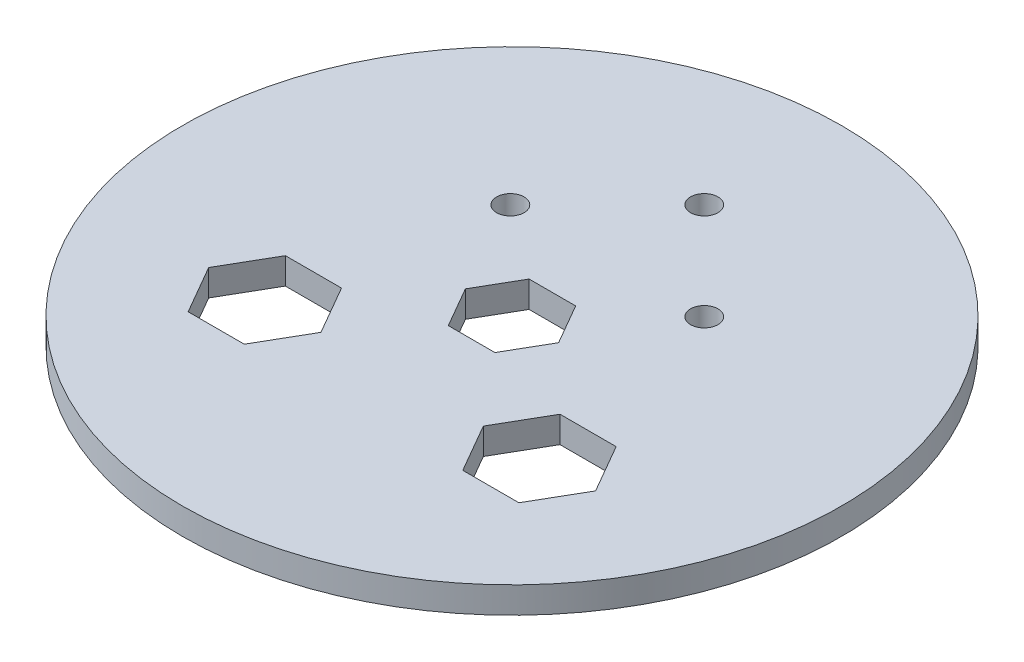
ISO-10303-21;
HEADER;
FILE_DESCRIPTION(('STEP AP214'),'2;1');
FILE_NAME('part.step','',(''),(''),'','','');
FILE_SCHEMA(('AUTOMOTIVE_DESIGN { 1 0 10303 214 1 1 1 1 }'));
ENDSEC;
DATA;
#1=APPLICATION_CONTEXT('core data for automotive mechanical design processes');
#2=APPLICATION_PROTOCOL_DEFINITION('international standard','automotive_design',2000,#1);
#3=PRODUCT_CONTEXT('',#1,'mechanical');
#4=PRODUCT('Part','Part','',(#3));
#5=PRODUCT_RELATED_PRODUCT_CATEGORY('part','',(#4));
#6=PRODUCT_DEFINITION_FORMATION('','',#4);
#7=PRODUCT_DEFINITION_CONTEXT('part definition',#1,'design');
#8=PRODUCT_DEFINITION('design','',#6,#7);
#9=PRODUCT_DEFINITION_SHAPE('','',#8);
#10=(LENGTH_UNIT() NAMED_UNIT(*) SI_UNIT(.MILLI.,.METRE.));
#11=(NAMED_UNIT(*) PLANE_ANGLE_UNIT() SI_UNIT($,.RADIAN.));
#12=(NAMED_UNIT(*) SI_UNIT($,.STERADIAN.) SOLID_ANGLE_UNIT());
#13=UNCERTAINTY_MEASURE_WITH_UNIT(LENGTH_MEASURE(1.E-05),#10,'distance_accuracy_value','');
#14=(GEOMETRIC_REPRESENTATION_CONTEXT(3) GLOBAL_UNCERTAINTY_ASSIGNED_CONTEXT((#13)) GLOBAL_UNIT_ASSIGNED_CONTEXT((#10,
#11,#12)) REPRESENTATION_CONTEXT('',''));
#15=CARTESIAN_POINT('',(0.,0.,0.));
#16=DIRECTION('',(0.,0.,1.));
#17=DIRECTION('',(1.,0.,0.));
#18=AXIS2_PLACEMENT_3D('',#15,#16,#17);
#19=CARTESIAN_POINT('',(0.,2.4,0.));
#20=DIRECTION('',(0.,1.,0.));
#21=DIRECTION('',(0.,0.,1.));
#22=AXIS2_PLACEMENT_3D('',#19,#20,#21);
#23=PLANE('',#22);
#24=CARTESIAN_POINT('',(-1.57534575662144E-13,2.4,-35.0000000000001));
#25=DIRECTION('',(0.,1.,0.));
#26=DIRECTION('',(0.,0.,1.));
#27=AXIS2_PLACEMENT_3D('',#24,#25,#26);
#28=CIRCLE('',#27,2.5);
#29=CARTESIAN_POINT('',(-1.57534575662144E-13,2.4,-32.5000000000001));
#30=VERTEX_POINT('',#29);
#31=EDGE_CURVE('E459',#30,#30,#28,.T.);
#32=ORIENTED_EDGE('',*,*,#31,.F.);
#33=EDGE_LOOP('',(#32));
#34=FACE_BOUND('',#33,.T.);
#35=CARTESIAN_POINT('',(17.6499999999998,2.4,-17.3500000000001));
#36=DIRECTION('',(0.,1.,0.));
#37=DIRECTION('',(0.,0.,1.));
#38=AXIS2_PLACEMENT_3D('',#35,#36,#37);
#39=CIRCLE('',#38,2.5);
#40=CARTESIAN_POINT('',(17.6499999999998,2.4,-14.8500000000001));
#41=VERTEX_POINT('',#40);
#42=EDGE_CURVE('E464',#41,#41,#39,.T.);
#43=ORIENTED_EDGE('',*,*,#42,.F.);
#44=EDGE_LOOP('',(#43));
#45=FACE_BOUND('',#44,.T.);
#46=CARTESIAN_POINT('',(-17.6500000000002,2.4,-17.3500000000001));
#47=DIRECTION('',(0.,1.,0.));
#48=DIRECTION('',(0.,0.,1.));
#49=AXIS2_PLACEMENT_3D('',#46,#47,#48);
#50=CIRCLE('',#49,2.5);
#51=CARTESIAN_POINT('',(-17.6500000000002,2.4,-14.8500000000001));
#52=VERTEX_POINT('',#51);
#53=EDGE_CURVE('E471',#52,#52,#50,.T.);
#54=ORIENTED_EDGE('',*,*,#53,.F.);
#55=EDGE_LOOP('',(#54));
#56=FACE_BOUND('',#55,.T.);
#57=CARTESIAN_POINT('',(0.,2.4,0.));
#58=DIRECTION('',(0.,1.,0.));
#59=DIRECTION('',(0.,0.,1.));
#60=AXIS2_PLACEMENT_3D('',#57,#58,#59);
#61=CIRCLE('',#60,60.);
#62=CARTESIAN_POINT('',(0.,2.4,60.));
#63=VERTEX_POINT('',#62);
#64=EDGE_CURVE('E11',#63,#63,#61,.T.);
#65=ORIENTED_EDGE('',*,*,#64,.T.);
#66=EDGE_LOOP('',(#65));
#67=FACE_BOUND('',#66,.T.);
#68=DIRECTION('',(-0.5,0.,-0.866025403784438));
#69=VECTOR('',#68,1.);
#70=CARTESIAN_POINT('',(8.4870489570875,2.4,0.));
#71=LINE('',#70,#69);
#72=CARTESIAN_POINT('',(8.4870489570875,2.4,0.));
#73=VERTEX_POINT('',#72);
#74=CARTESIAN_POINT('',(4.24352447854375,2.4,-7.35));
#75=VERTEX_POINT('',#74);
#76=EDGE_CURVE('E258',#73,#75,#71,.T.);
#77=ORIENTED_EDGE('',*,*,#76,.F.);
#78=DIRECTION('',(0.5,0.,-0.866025403784439));
#79=VECTOR('',#78,1.);
#80=CARTESIAN_POINT('',(4.24352447854375,2.4,7.35));
#81=LINE('',#80,#79);
#82=CARTESIAN_POINT('',(4.24352447854375,2.4,7.35));
#83=VERTEX_POINT('',#82);
#84=EDGE_CURVE('E256',#83,#73,#81,.T.);
#85=ORIENTED_EDGE('',*,*,#84,.F.);
#86=DIRECTION('',(1.,0.,0.));
#87=VECTOR('',#86,1.);
#88=CARTESIAN_POINT('',(-4.24352447854375,2.4,7.35));
#89=LINE('',#88,#87);
#90=CARTESIAN_POINT('',(-4.24352447854375,2.4,7.35));
#91=VERTEX_POINT('',#90);
#92=EDGE_CURVE('E268',#91,#83,#89,.T.);
#93=ORIENTED_EDGE('',*,*,#92,.F.);
#94=DIRECTION('',(0.5,0.,0.866025403784439));
#95=VECTOR('',#94,1.);
#96=CARTESIAN_POINT('',(-8.4870489570875,2.4,0.));
#97=LINE('',#96,#95);
#98=CARTESIAN_POINT('',(-8.4870489570875,2.4,0.));
#99=VERTEX_POINT('',#98);
#100=EDGE_CURVE('E265',#99,#91,#97,.T.);
#101=ORIENTED_EDGE('',*,*,#100,.F.);
#102=DIRECTION('',(-0.5,0.,0.866025403784439));
#103=VECTOR('',#102,1.);
#104=CARTESIAN_POINT('',(-4.24352447854375,2.4,-7.35));
#105=LINE('',#104,#103);
#106=CARTESIAN_POINT('',(-4.24352447854375,2.4,-7.35));
#107=VERTEX_POINT('',#106);
#108=EDGE_CURVE('E263',#107,#99,#105,.T.);
#109=ORIENTED_EDGE('',*,*,#108,.F.);
#110=DIRECTION('',(-1.,0.,0.));
#111=VECTOR('',#110,1.);
#112=CARTESIAN_POINT('',(4.24352447854375,2.4,-7.35));
#113=LINE('',#112,#111);
#114=EDGE_CURVE('E261',#75,#107,#113,.T.);
#115=ORIENTED_EDGE('',*,*,#114,.F.);
#116=EDGE_LOOP('',(#77,#85,#93,#101,#109,#115));
#117=FACE_BOUND('',#116,.T.);
#118=DIRECTION('',(-0.5,0.,-0.866025403784439));
#119=VECTOR('',#118,1.);
#120=CARTESIAN_POINT('',(-14.7809002353436,2.4,20.));
#121=LINE('',#120,#119);
#122=CARTESIAN_POINT('',(-14.7809002353436,2.4,20.));
#123=VERTEX_POINT('',#122);
#124=CARTESIAN_POINT('',(-19.8904501176718,2.4,11.15));
#125=VERTEX_POINT('',#124);
#126=EDGE_CURVE('E213',#123,#125,#121,.T.);
#127=ORIENTED_EDGE('',*,*,#126,.F.);
#128=DIRECTION('',(0.5,0.,-0.866025403784439));
#129=VECTOR('',#128,1.);
#130=CARTESIAN_POINT('',(-19.8904501176718,2.4,28.85));
#131=LINE('',#130,#129);
#132=CARTESIAN_POINT('',(-19.8904501176718,2.4,28.85));
#133=VERTEX_POINT('',#132);
#134=EDGE_CURVE('E211',#133,#123,#131,.T.);
#135=ORIENTED_EDGE('',*,*,#134,.F.);
#136=DIRECTION('',(1.,0.,0.));
#137=VECTOR('',#136,1.);
#138=CARTESIAN_POINT('',(-30.1095498823282,2.4,28.85));
#139=LINE('',#138,#137);
#140=CARTESIAN_POINT('',(-30.1095498823282,2.4,28.85));
#141=VERTEX_POINT('',#140);
#142=EDGE_CURVE('E223',#141,#133,#139,.T.);
#143=ORIENTED_EDGE('',*,*,#142,.F.);
#144=DIRECTION('',(0.5,0.,0.866025403784439));
#145=VECTOR('',#144,1.);
#146=CARTESIAN_POINT('',(-35.2190997646564,2.4,20.));
#147=LINE('',#146,#145);
#148=CARTESIAN_POINT('',(-35.2190997646564,2.4,20.));
#149=VERTEX_POINT('',#148);
#150=EDGE_CURVE('E220',#149,#141,#147,.T.);
#151=ORIENTED_EDGE('',*,*,#150,.F.);
#152=DIRECTION('',(-0.5,0.,0.866025403784439));
#153=VECTOR('',#152,1.);
#154=CARTESIAN_POINT('',(-30.1095498823282,2.4,11.15));
#155=LINE('',#154,#153);
#156=CARTESIAN_POINT('',(-30.1095498823282,2.4,11.15));
#157=VERTEX_POINT('',#156);
#158=EDGE_CURVE('E218',#157,#149,#155,.T.);
#159=ORIENTED_EDGE('',*,*,#158,.F.);
#160=DIRECTION('',(-1.,0.,0.));
#161=VECTOR('',#160,1.);
#162=CARTESIAN_POINT('',(-19.8904501176718,2.4,11.15));
#163=LINE('',#162,#161);
#164=EDGE_CURVE('E216',#125,#157,#163,.T.);
#165=ORIENTED_EDGE('',*,*,#164,.F.);
#166=EDGE_LOOP('',(#127,#135,#143,#151,#159,#165));
#167=FACE_BOUND('',#166,.T.);
#168=DIRECTION('',(-0.5,0.,-0.866025403784439));
#169=VECTOR('',#168,1.);
#170=CARTESIAN_POINT('',(35.2190997646564,2.4,20.));
#171=LINE('',#170,#169);
#172=CARTESIAN_POINT('',(35.2190997646564,2.4,20.));
#173=VERTEX_POINT('',#172);
#174=CARTESIAN_POINT('',(30.1095498823282,2.4,11.15));
#175=VERTEX_POINT('',#174);
#176=EDGE_CURVE('E166',#173,#175,#171,.T.);
#177=ORIENTED_EDGE('',*,*,#176,.F.);
#178=DIRECTION('',(0.5,0.,-0.866025403784439));
#179=VECTOR('',#178,1.);
#180=CARTESIAN_POINT('',(30.1095498823282,2.4,28.85));
#181=LINE('',#180,#179);
#182=CARTESIAN_POINT('',(30.1095498823282,2.4,28.85));
#183=VERTEX_POINT('',#182);
#184=EDGE_CURVE('E158',#183,#173,#181,.T.);
#185=ORIENTED_EDGE('',*,*,#184,.F.);
#186=DIRECTION('',(1.,0.,0.));
#187=VECTOR('',#186,1.);
#188=CARTESIAN_POINT('',(19.8904501176718,2.4,28.85));
#189=LINE('',#188,#187);
#190=CARTESIAN_POINT('',(19.8904501176718,2.4,28.85));
#191=VERTEX_POINT('',#190);
#192=EDGE_CURVE('E188',#191,#183,#189,.T.);
#193=ORIENTED_EDGE('',*,*,#192,.F.);
#194=DIRECTION('',(0.5,0.,0.866025403784439));
#195=VECTOR('',#194,1.);
#196=CARTESIAN_POINT('',(14.7809002353436,2.4,20.));
#197=LINE('',#196,#195);
#198=CARTESIAN_POINT('',(14.7809002353436,2.4,20.));
#199=VERTEX_POINT('',#198);
#200=EDGE_CURVE('E186',#199,#191,#197,.T.);
#201=ORIENTED_EDGE('',*,*,#200,.F.);
#202=DIRECTION('',(-0.5,0.,0.866025403784439));
#203=VECTOR('',#202,1.);
#204=CARTESIAN_POINT('',(19.8904501176718,2.4,11.15));
#205=LINE('',#204,#203);
#206=CARTESIAN_POINT('',(19.8904501176718,2.4,11.15));
#207=VERTEX_POINT('',#206);
#208=EDGE_CURVE('E181',#207,#199,#205,.T.);
#209=ORIENTED_EDGE('',*,*,#208,.F.);
#210=DIRECTION('',(-1.,0.,0.));
#211=VECTOR('',#210,1.);
#212=CARTESIAN_POINT('',(30.1095498823282,2.4,11.15));
#213=LINE('',#212,#211);
#214=EDGE_CURVE('E179',#175,#207,#213,.T.);
#215=ORIENTED_EDGE('',*,*,#214,.F.);
#216=EDGE_LOOP('',(#177,#185,#193,#201,#209,#215));
#217=FACE_BOUND('',#216,.T.);
#218=ADVANCED_FACE('F33',(#34,#45,#56,#67,#117,#167,#217),#23,.T.);
#219=CARTESIAN_POINT('',(0.,-2.4,0.));
#220=DIRECTION('',(0.,1.,0.));
#221=DIRECTION('',(0.,0.,1.));
#222=AXIS2_PLACEMENT_3D('',#219,#220,#221);
#223=PLANE('',#222);
#224=CARTESIAN_POINT('',(-1.57534575662144E-13,-2.4,-35.0000000000001));
#225=DIRECTION('',(0.,1.,0.));
#226=DIRECTION('',(0.,0.,1.));
#227=AXIS2_PLACEMENT_3D('',#224,#225,#226);
#228=CIRCLE('',#227,2.5);
#229=CARTESIAN_POINT('',(-1.57534575662144E-13,-2.4,-32.5000000000001));
#230=VERTEX_POINT('',#229);
#231=EDGE_CURVE('E191',#230,#230,#228,.T.);
#232=ORIENTED_EDGE('',*,*,#231,.T.);
#233=EDGE_LOOP('',(#232));
#234=FACE_BOUND('',#233,.T.);
#235=CARTESIAN_POINT('',(17.6499999999998,-2.4,-17.3500000000001));
#236=DIRECTION('',(0.,1.,0.));
#237=DIRECTION('',(0.,0.,1.));
#238=AXIS2_PLACEMENT_3D('',#235,#236,#237);
#239=CIRCLE('',#238,2.5);
#240=CARTESIAN_POINT('',(17.6499999999998,-2.4,-14.8500000000001));
#241=VERTEX_POINT('',#240);
#242=EDGE_CURVE('E460',#241,#241,#239,.T.);
#243=ORIENTED_EDGE('',*,*,#242,.T.);
#244=EDGE_LOOP('',(#243));
#245=FACE_BOUND('',#244,.T.);
#246=CARTESIAN_POINT('',(-17.6500000000002,-2.4,-17.3500000000001));
#247=DIRECTION('',(0.,1.,0.));
#248=DIRECTION('',(0.,0.,1.));
#249=AXIS2_PLACEMENT_3D('',#246,#247,#248);
#250=CIRCLE('',#249,2.5);
#251=CARTESIAN_POINT('',(-17.6500000000002,-2.4,-14.8500000000001));
#252=VERTEX_POINT('',#251);
#253=EDGE_CURVE('E469',#252,#252,#250,.T.);
#254=ORIENTED_EDGE('',*,*,#253,.T.);
#255=EDGE_LOOP('',(#254));
#256=FACE_BOUND('',#255,.T.);
#257=DIRECTION('',(0.5,0.,-0.866025403784439));
#258=VECTOR('',#257,1.);
#259=CARTESIAN_POINT('',(-19.8904501176718,-2.4,28.85));
#260=LINE('',#259,#258);
#261=CARTESIAN_POINT('',(-19.8904501176718,-2.4,28.85));
#262=VERTEX_POINT('',#261);
#263=CARTESIAN_POINT('',(-14.7809002353436,-2.4,20.));
#264=VERTEX_POINT('',#263);
#265=EDGE_CURVE('E174',#262,#264,#260,.T.);
#266=ORIENTED_EDGE('',*,*,#265,.T.);
#267=DIRECTION('',(-0.5,0.,-0.866025403784439));
#268=VECTOR('',#267,1.);
#269=CARTESIAN_POINT('',(-14.7809002353436,-2.4,20.));
#270=LINE('',#269,#268);
#271=CARTESIAN_POINT('',(-19.8904501176718,-2.4,11.15));
#272=VERTEX_POINT('',#271);
#273=EDGE_CURVE('E228',#264,#272,#270,.T.);
#274=ORIENTED_EDGE('',*,*,#273,.T.);
#275=DIRECTION('',(-1.,0.,0.));
#276=VECTOR('',#275,1.);
#277=CARTESIAN_POINT('',(-19.8904501176718,-2.4,11.15));
#278=LINE('',#277,#276);
#279=CARTESIAN_POINT('',(-30.1095498823282,-2.4,11.15));
#280=VERTEX_POINT('',#279);
#281=EDGE_CURVE('E231',#272,#280,#278,.T.);
#282=ORIENTED_EDGE('',*,*,#281,.T.);
#283=DIRECTION('',(-0.5,0.,0.866025403784439));
#284=VECTOR('',#283,1.);
#285=CARTESIAN_POINT('',(-30.1095498823282,-2.4,11.15));
#286=LINE('',#285,#284);
#287=CARTESIAN_POINT('',(-35.2190997646564,-2.4,20.));
#288=VERTEX_POINT('',#287);
#289=EDGE_CURVE('E234',#280,#288,#286,.T.);
#290=ORIENTED_EDGE('',*,*,#289,.T.);
#291=DIRECTION('',(0.5,0.,0.866025403784439));
#292=VECTOR('',#291,1.);
#293=CARTESIAN_POINT('',(-35.2190997646564,-2.4,20.));
#294=LINE('',#293,#292);
#295=CARTESIAN_POINT('',(-30.1095498823282,-2.4,28.85));
#296=VERTEX_POINT('',#295);
#297=EDGE_CURVE('E237',#288,#296,#294,.T.);
#298=ORIENTED_EDGE('',*,*,#297,.T.);
#299=DIRECTION('',(1.,0.,0.));
#300=VECTOR('',#299,1.);
#301=CARTESIAN_POINT('',(-30.1095498823282,-2.4,28.85));
#302=LINE('',#301,#300);
#303=EDGE_CURVE('E214',#296,#262,#302,.T.);
#304=ORIENTED_EDGE('',*,*,#303,.T.);
#305=EDGE_LOOP('',(#266,#274,#282,#290,#298,#304));
#306=FACE_BOUND('',#305,.T.);
#307=CARTESIAN_POINT('',(0.,-2.4,0.));
#308=DIRECTION('',(0.,1.,0.));
#309=DIRECTION('',(0.,0.,1.));
#310=AXIS2_PLACEMENT_3D('',#307,#308,#309);
#311=CIRCLE('',#310,60.);
#312=CARTESIAN_POINT('',(0.,-2.4,60.));
#313=VERTEX_POINT('',#312);
#314=EDGE_CURVE('E37',#313,#313,#311,.T.);
#315=ORIENTED_EDGE('',*,*,#314,.F.);
#316=EDGE_LOOP('',(#315));
#317=FACE_BOUND('',#316,.T.);
#318=DIRECTION('',(0.5,0.,-0.866025403784439));
#319=VECTOR('',#318,1.);
#320=CARTESIAN_POINT('',(4.24352447854375,-2.4,7.35));
#321=LINE('',#320,#319);
#322=CARTESIAN_POINT('',(4.24352447854375,-2.4,7.35));
#323=VERTEX_POINT('',#322);
#324=CARTESIAN_POINT('',(8.4870489570875,-2.4,0.));
#325=VERTEX_POINT('',#324);
#326=EDGE_CURVE('E255',#323,#325,#321,.T.);
#327=ORIENTED_EDGE('',*,*,#326,.T.);
#328=DIRECTION('',(-0.5,0.,-0.866025403784438));
#329=VECTOR('',#328,1.);
#330=CARTESIAN_POINT('',(8.4870489570875,-2.4,0.));
#331=LINE('',#330,#329);
#332=CARTESIAN_POINT('',(4.24352447854375,-2.4,-7.35));
#333=VERTEX_POINT('',#332);
#334=EDGE_CURVE('E273',#325,#333,#331,.T.);
#335=ORIENTED_EDGE('',*,*,#334,.T.);
#336=DIRECTION('',(-1.,0.,0.));
#337=VECTOR('',#336,1.);
#338=CARTESIAN_POINT('',(4.24352447854375,-2.4,-7.35));
#339=LINE('',#338,#337);
#340=CARTESIAN_POINT('',(-4.24352447854375,-2.4,-7.35));
#341=VERTEX_POINT('',#340);
#342=EDGE_CURVE('E276',#333,#341,#339,.T.);
#343=ORIENTED_EDGE('',*,*,#342,.T.);
#344=DIRECTION('',(-0.5,0.,0.866025403784439));
#345=VECTOR('',#344,1.);
#346=CARTESIAN_POINT('',(-4.24352447854375,-2.4,-7.35));
#347=LINE('',#346,#345);
#348=CARTESIAN_POINT('',(-8.4870489570875,-2.4,0.));
#349=VERTEX_POINT('',#348);
#350=EDGE_CURVE('E279',#341,#349,#347,.T.);
#351=ORIENTED_EDGE('',*,*,#350,.T.);
#352=DIRECTION('',(0.5,0.,0.866025403784439));
#353=VECTOR('',#352,1.);
#354=CARTESIAN_POINT('',(-8.4870489570875,-2.4,0.));
#355=LINE('',#354,#353);
#356=CARTESIAN_POINT('',(-4.24352447854375,-2.4,7.35));
#357=VERTEX_POINT('',#356);
#358=EDGE_CURVE('E282',#349,#357,#355,.T.);
#359=ORIENTED_EDGE('',*,*,#358,.T.);
#360=DIRECTION('',(1.,0.,0.));
#361=VECTOR('',#360,1.);
#362=CARTESIAN_POINT('',(-4.24352447854375,-2.4,7.35));
#363=LINE('',#362,#361);
#364=EDGE_CURVE('E259',#357,#323,#363,.T.);
#365=ORIENTED_EDGE('',*,*,#364,.T.);
#366=EDGE_LOOP('',(#327,#335,#343,#351,#359,#365));
#367=FACE_BOUND('',#366,.T.);
#368=DIRECTION('',(0.5,0.,-0.866025403784439));
#369=VECTOR('',#368,1.);
#370=CARTESIAN_POINT('',(30.1095498823282,-2.4,28.85));
#371=LINE('',#370,#369);
#372=CARTESIAN_POINT('',(30.1095498823282,-2.4,28.85));
#373=VERTEX_POINT('',#372);
#374=CARTESIAN_POINT('',(35.2190997646564,-2.4,20.));
#375=VERTEX_POINT('',#374);
#376=EDGE_CURVE('E56',#373,#375,#371,.T.);
#377=ORIENTED_EDGE('',*,*,#376,.T.);
#378=DIRECTION('',(-0.5,0.,-0.866025403784439));
#379=VECTOR('',#378,1.);
#380=CARTESIAN_POINT('',(35.2190997646564,-2.4,20.));
#381=LINE('',#380,#379);
#382=CARTESIAN_POINT('',(30.1095498823282,-2.4,11.15));
#383=VERTEX_POINT('',#382);
#384=EDGE_CURVE('E173',#375,#383,#381,.T.);
#385=ORIENTED_EDGE('',*,*,#384,.T.);
#386=DIRECTION('',(-1.,0.,0.));
#387=VECTOR('',#386,1.);
#388=CARTESIAN_POINT('',(30.1095498823282,-2.4,11.15));
#389=LINE('',#388,#387);
#390=CARTESIAN_POINT('',(19.8904501176718,-2.4,11.15));
#391=VERTEX_POINT('',#390);
#392=EDGE_CURVE('E193',#383,#391,#389,.T.);
#393=ORIENTED_EDGE('',*,*,#392,.T.);
#394=DIRECTION('',(-0.5,0.,0.866025403784439));
#395=VECTOR('',#394,1.);
#396=CARTESIAN_POINT('',(19.8904501176718,-2.4,11.15));
#397=LINE('',#396,#395);
#398=CARTESIAN_POINT('',(14.7809002353436,-2.4,20.));
#399=VERTEX_POINT('',#398);
#400=EDGE_CURVE('E196',#391,#399,#397,.T.);
#401=ORIENTED_EDGE('',*,*,#400,.T.);
#402=DIRECTION('',(0.5,0.,0.866025403784439));
#403=VECTOR('',#402,1.);
#404=CARTESIAN_POINT('',(14.7809002353436,-2.4,20.));
#405=LINE('',#404,#403);
#406=CARTESIAN_POINT('',(19.8904501176718,-2.4,28.85));
#407=VERTEX_POINT('',#406);
#408=EDGE_CURVE('E199',#399,#407,#405,.T.);
#409=ORIENTED_EDGE('',*,*,#408,.T.);
#410=DIRECTION('',(1.,0.,0.));
#411=VECTOR('',#410,1.);
#412=CARTESIAN_POINT('',(19.8904501176718,-2.4,28.85));
#413=LINE('',#412,#411);
#414=EDGE_CURVE('E167',#407,#373,#413,.T.);
#415=ORIENTED_EDGE('',*,*,#414,.T.);
#416=EDGE_LOOP('',(#377,#385,#393,#401,#409,#415));
#417=FACE_BOUND('',#416,.T.);
#418=ADVANCED_FACE('F305',(#234,#245,#256,#306,#317,#367,#417),#223,.F.);
#419=CARTESIAN_POINT('',(0.,2.4,0.));
#420=DIRECTION('',(0.,-1.,0.));
#421=DIRECTION('',(0.,0.,-1.));
#422=AXIS2_PLACEMENT_3D('',#419,#420,#421);
#423=CYLINDRICAL_SURFACE('',#422,60.);
#424=ORIENTED_EDGE('',*,*,#64,.F.);
#425=EDGE_LOOP('',(#424));
#426=FACE_BOUND('',#425,.T.);
#427=ORIENTED_EDGE('',*,*,#314,.T.);
#428=EDGE_LOOP('',(#427));
#429=FACE_BOUND('',#428,.T.);
#430=ADVANCED_FACE('F35',(#426,#429),#423,.T.);
#431=CARTESIAN_POINT('',(4.24352447854375,2.4,7.35));
#432=DIRECTION('',(-0.866025403784439,0.,-0.5));
#433=DIRECTION('',(-0.5,0.,0.866025403784439));
#434=AXIS2_PLACEMENT_3D('',#431,#432,#433);
#435=PLANE('',#434);
#436=ORIENTED_EDGE('',*,*,#326,.F.);
#437=DIRECTION('',(0.,-1.,0.));
#438=VECTOR('',#437,1.);
#439=CARTESIAN_POINT('',(4.24352447854375,2.4,7.35));
#440=LINE('',#439,#438);
#441=EDGE_CURVE('E270',#83,#323,#440,.T.);
#442=ORIENTED_EDGE('',*,*,#441,.F.);
#443=ORIENTED_EDGE('',*,*,#84,.T.);
#444=DIRECTION('',(0.,-1.,0.));
#445=VECTOR('',#444,1.);
#446=CARTESIAN_POINT('',(8.4870489570875,2.4,0.));
#447=LINE('',#446,#445);
#448=EDGE_CURVE('E297',#73,#325,#447,.T.);
#449=ORIENTED_EDGE('',*,*,#448,.T.);
#450=EDGE_LOOP('',(#436,#442,#443,#449));
#451=FACE_BOUND('',#450,.T.);
#452=ADVANCED_FACE('F340',(#451),#435,.T.);
#453=CARTESIAN_POINT('',(8.4870489570875,2.4,0.));
#454=DIRECTION('',(-0.866025403784438,0.,0.5));
#455=DIRECTION('',(0.5,0.,0.866025403784438));
#456=AXIS2_PLACEMENT_3D('',#453,#454,#455);
#457=PLANE('',#456);
#458=ORIENTED_EDGE('',*,*,#334,.F.);
#459=ORIENTED_EDGE('',*,*,#448,.F.);
#460=ORIENTED_EDGE('',*,*,#76,.T.);
#461=DIRECTION('',(0.,-1.,0.));
#462=VECTOR('',#461,1.);
#463=CARTESIAN_POINT('',(4.24352447854375,2.4,-7.35));
#464=LINE('',#463,#462);
#465=EDGE_CURVE('E295',#75,#333,#464,.T.);
#466=ORIENTED_EDGE('',*,*,#465,.T.);
#467=EDGE_LOOP('',(#458,#459,#460,#466));
#468=FACE_BOUND('',#467,.T.);
#469=ADVANCED_FACE('F343',(#468),#457,.T.);
#470=CARTESIAN_POINT('',(4.24352447854375,2.4,-7.35));
#471=DIRECTION('',(0.,0.,1.));
#472=DIRECTION('',(1.,0.,0.));
#473=AXIS2_PLACEMENT_3D('',#470,#471,#472);
#474=PLANE('',#473);
#475=ORIENTED_EDGE('',*,*,#342,.F.);
#476=ORIENTED_EDGE('',*,*,#465,.F.);
#477=ORIENTED_EDGE('',*,*,#114,.T.);
#478=DIRECTION('',(0.,-1.,0.));
#479=VECTOR('',#478,1.);
#480=CARTESIAN_POINT('',(-4.24352447854375,2.4,-7.35));
#481=LINE('',#480,#479);
#482=EDGE_CURVE('E293',#107,#341,#481,.T.);
#483=ORIENTED_EDGE('',*,*,#482,.T.);
#484=EDGE_LOOP('',(#475,#476,#477,#483));
#485=FACE_BOUND('',#484,.T.);
#486=ADVANCED_FACE('F346',(#485),#474,.T.);
#487=CARTESIAN_POINT('',(-4.24352447854375,2.4,-7.35));
#488=DIRECTION('',(0.866025403784439,0.,0.5));
#489=DIRECTION('',(0.5,0.,-0.866025403784439));
#490=AXIS2_PLACEMENT_3D('',#487,#488,#489);
#491=PLANE('',#490);
#492=ORIENTED_EDGE('',*,*,#350,.F.);
#493=ORIENTED_EDGE('',*,*,#482,.F.);
#494=ORIENTED_EDGE('',*,*,#108,.T.);
#495=DIRECTION('',(0.,-1.,0.));
#496=VECTOR('',#495,1.);
#497=CARTESIAN_POINT('',(-8.4870489570875,2.4,0.));
#498=LINE('',#497,#496);
#499=EDGE_CURVE('E291',#99,#349,#498,.T.);
#500=ORIENTED_EDGE('',*,*,#499,.T.);
#501=EDGE_LOOP('',(#492,#493,#494,#500));
#502=FACE_BOUND('',#501,.T.);
#503=ADVANCED_FACE('F350',(#502),#491,.T.);
#504=CARTESIAN_POINT('',(-8.4870489570875,2.4,0.));
#505=DIRECTION('',(0.866025403784439,0.,-0.5));
#506=DIRECTION('',(-0.5,0.,-0.866025403784439));
#507=AXIS2_PLACEMENT_3D('',#504,#505,#506);
#508=PLANE('',#507);
#509=ORIENTED_EDGE('',*,*,#358,.F.);
#510=ORIENTED_EDGE('',*,*,#499,.F.);
#511=ORIENTED_EDGE('',*,*,#100,.T.);
#512=DIRECTION('',(0.,-1.,0.));
#513=VECTOR('',#512,1.);
#514=CARTESIAN_POINT('',(-4.24352447854375,2.4,7.35));
#515=LINE('',#514,#513);
#516=EDGE_CURVE('E289',#91,#357,#515,.T.);
#517=ORIENTED_EDGE('',*,*,#516,.T.);
#518=EDGE_LOOP('',(#509,#510,#511,#517));
#519=FACE_BOUND('',#518,.T.);
#520=ADVANCED_FACE('F354',(#519),#508,.T.);
#521=CARTESIAN_POINT('',(-4.24352447854375,2.4,7.35));
#522=DIRECTION('',(0.,0.,-1.));
#523=DIRECTION('',(-1.,0.,0.));
#524=AXIS2_PLACEMENT_3D('',#521,#522,#523);
#525=PLANE('',#524);
#526=ORIENTED_EDGE('',*,*,#364,.F.);
#527=ORIENTED_EDGE('',*,*,#516,.F.);
#528=ORIENTED_EDGE('',*,*,#92,.T.);
#529=ORIENTED_EDGE('',*,*,#441,.T.);
#530=EDGE_LOOP('',(#526,#527,#528,#529));
#531=FACE_BOUND('',#530,.T.);
#532=ADVANCED_FACE('F358',(#531),#525,.T.);
#533=CARTESIAN_POINT('',(-19.8904501176718,2.4,28.85));
#534=DIRECTION('',(-0.866025403784439,0.,-0.5));
#535=DIRECTION('',(-0.5,0.,0.866025403784439));
#536=AXIS2_PLACEMENT_3D('',#533,#534,#535);
#537=PLANE('',#536);
#538=ORIENTED_EDGE('',*,*,#265,.F.);
#539=DIRECTION('',(0.,-1.,0.));
#540=VECTOR('',#539,1.);
#541=CARTESIAN_POINT('',(-19.8904501176718,2.4,28.85));
#542=LINE('',#541,#540);
#543=EDGE_CURVE('E225',#133,#262,#542,.T.);
#544=ORIENTED_EDGE('',*,*,#543,.F.);
#545=ORIENTED_EDGE('',*,*,#134,.T.);
#546=DIRECTION('',(0.,-1.,0.));
#547=VECTOR('',#546,1.);
#548=CARTESIAN_POINT('',(-14.7809002353436,2.4,20.));
#549=LINE('',#548,#547);
#550=EDGE_CURVE('E252',#123,#264,#549,.T.);
#551=ORIENTED_EDGE('',*,*,#550,.T.);
#552=EDGE_LOOP('',(#538,#544,#545,#551));
#553=FACE_BOUND('',#552,.T.);
#554=ADVANCED_FACE('F362',(#553),#537,.T.);
#555=CARTESIAN_POINT('',(-14.7809002353436,2.4,20.));
#556=DIRECTION('',(-0.866025403784439,0.,0.5));
#557=DIRECTION('',(0.5,0.,0.866025403784439));
#558=AXIS2_PLACEMENT_3D('',#555,#556,#557);
#559=PLANE('',#558);
#560=ORIENTED_EDGE('',*,*,#273,.F.);
#561=ORIENTED_EDGE('',*,*,#550,.F.);
#562=ORIENTED_EDGE('',*,*,#126,.T.);
#563=DIRECTION('',(0.,-1.,0.));
#564=VECTOR('',#563,1.);
#565=CARTESIAN_POINT('',(-19.8904501176718,2.4,11.15));
#566=LINE('',#565,#564);
#567=EDGE_CURVE('E250',#125,#272,#566,.T.);
#568=ORIENTED_EDGE('',*,*,#567,.T.);
#569=EDGE_LOOP('',(#560,#561,#562,#568));
#570=FACE_BOUND('',#569,.T.);
#571=ADVANCED_FACE('F366',(#570),#559,.T.);
#572=CARTESIAN_POINT('',(-19.8904501176718,2.4,11.15));
#573=DIRECTION('',(0.,0.,1.));
#574=DIRECTION('',(1.,0.,0.));
#575=AXIS2_PLACEMENT_3D('',#572,#573,#574);
#576=PLANE('',#575);
#577=ORIENTED_EDGE('',*,*,#281,.F.);
#578=ORIENTED_EDGE('',*,*,#567,.F.);
#579=ORIENTED_EDGE('',*,*,#164,.T.);
#580=DIRECTION('',(0.,-1.,0.));
#581=VECTOR('',#580,1.);
#582=CARTESIAN_POINT('',(-30.1095498823282,2.4,11.15));
#583=LINE('',#582,#581);
#584=EDGE_CURVE('E248',#157,#280,#583,.T.);
#585=ORIENTED_EDGE('',*,*,#584,.T.);
#586=EDGE_LOOP('',(#577,#578,#579,#585));
#587=FACE_BOUND('',#586,.T.);
#588=ADVANCED_FACE('F370',(#587),#576,.T.);
#589=CARTESIAN_POINT('',(-30.1095498823282,2.4,11.15));
#590=DIRECTION('',(0.866025403784439,0.,0.5));
#591=DIRECTION('',(0.5,0.,-0.866025403784439));
#592=AXIS2_PLACEMENT_3D('',#589,#590,#591);
#593=PLANE('',#592);
#594=ORIENTED_EDGE('',*,*,#289,.F.);
#595=ORIENTED_EDGE('',*,*,#584,.F.);
#596=ORIENTED_EDGE('',*,*,#158,.T.);
#597=DIRECTION('',(0.,-1.,0.));
#598=VECTOR('',#597,1.);
#599=CARTESIAN_POINT('',(-35.2190997646564,2.4,20.));
#600=LINE('',#599,#598);
#601=EDGE_CURVE('E246',#149,#288,#600,.T.);
#602=ORIENTED_EDGE('',*,*,#601,.T.);
#603=EDGE_LOOP('',(#594,#595,#596,#602));
#604=FACE_BOUND('',#603,.T.);
#605=ADVANCED_FACE('F374',(#604),#593,.T.);
#606=CARTESIAN_POINT('',(-35.2190997646564,2.4,20.));
#607=DIRECTION('',(0.866025403784439,0.,-0.5));
#608=DIRECTION('',(-0.5,0.,-0.866025403784439));
#609=AXIS2_PLACEMENT_3D('',#606,#607,#608);
#610=PLANE('',#609);
#611=ORIENTED_EDGE('',*,*,#297,.F.);
#612=ORIENTED_EDGE('',*,*,#601,.F.);
#613=ORIENTED_EDGE('',*,*,#150,.T.);
#614=DIRECTION('',(0.,-1.,0.));
#615=VECTOR('',#614,1.);
#616=CARTESIAN_POINT('',(-30.1095498823282,2.4,28.85));
#617=LINE('',#616,#615);
#618=EDGE_CURVE('E244',#141,#296,#617,.T.);
#619=ORIENTED_EDGE('',*,*,#618,.T.);
#620=EDGE_LOOP('',(#611,#612,#613,#619));
#621=FACE_BOUND('',#620,.T.);
#622=ADVANCED_FACE('F378',(#621),#610,.T.);
#623=CARTESIAN_POINT('',(-30.1095498823282,2.4,28.85));
#624=DIRECTION('',(0.,0.,-1.));
#625=DIRECTION('',(-1.,0.,0.));
#626=AXIS2_PLACEMENT_3D('',#623,#624,#625);
#627=PLANE('',#626);
#628=ORIENTED_EDGE('',*,*,#303,.F.);
#629=ORIENTED_EDGE('',*,*,#618,.F.);
#630=ORIENTED_EDGE('',*,*,#142,.T.);
#631=ORIENTED_EDGE('',*,*,#543,.T.);
#632=EDGE_LOOP('',(#628,#629,#630,#631));
#633=FACE_BOUND('',#632,.T.);
#634=ADVANCED_FACE('F382',(#633),#627,.T.);
#635=CARTESIAN_POINT('',(30.1095498823282,2.4,28.85));
#636=DIRECTION('',(-0.866025403784439,0.,-0.5));
#637=DIRECTION('',(-0.5,0.,0.866025403784439));
#638=AXIS2_PLACEMENT_3D('',#635,#636,#637);
#639=PLANE('',#638);
#640=ORIENTED_EDGE('',*,*,#376,.F.);
#641=DIRECTION('',(0.,-1.,0.));
#642=VECTOR('',#641,1.);
#643=CARTESIAN_POINT('',(30.1095498823282,2.4,28.85));
#644=LINE('',#643,#642);
#645=EDGE_CURVE('E162',#183,#373,#644,.T.);
#646=ORIENTED_EDGE('',*,*,#645,.F.);
#647=ORIENTED_EDGE('',*,*,#184,.T.);
#648=DIRECTION('',(0.,-1.,0.));
#649=VECTOR('',#648,1.);
#650=CARTESIAN_POINT('',(35.2190997646564,2.4,20.));
#651=LINE('',#650,#649);
#652=EDGE_CURVE('E161',#173,#375,#651,.T.);
#653=ORIENTED_EDGE('',*,*,#652,.T.);
#654=EDGE_LOOP('',(#640,#646,#647,#653));
#655=FACE_BOUND('',#654,.T.);
#656=ADVANCED_FACE('F160',(#655),#639,.T.);
#657=CARTESIAN_POINT('',(35.2190997646564,2.4,20.));
#658=DIRECTION('',(-0.866025403784439,0.,0.5));
#659=DIRECTION('',(0.5,0.,0.866025403784439));
#660=AXIS2_PLACEMENT_3D('',#657,#658,#659);
#661=PLANE('',#660);
#662=ORIENTED_EDGE('',*,*,#384,.F.);
#663=ORIENTED_EDGE('',*,*,#652,.F.);
#664=ORIENTED_EDGE('',*,*,#176,.T.);
#665=DIRECTION('',(0.,-1.,0.));
#666=VECTOR('',#665,1.);
#667=CARTESIAN_POINT('',(30.1095498823282,2.4,11.15));
#668=LINE('',#667,#666);
#669=EDGE_CURVE('E175',#175,#383,#668,.T.);
#670=ORIENTED_EDGE('',*,*,#669,.T.);
#671=EDGE_LOOP('',(#662,#663,#664,#670));
#672=FACE_BOUND('',#671,.T.);
#673=ADVANCED_FACE('F170',(#672),#661,.T.);
#674=CARTESIAN_POINT('',(30.1095498823282,2.4,11.15));
#675=DIRECTION('',(0.,0.,1.));
#676=DIRECTION('',(1.,0.,0.));
#677=AXIS2_PLACEMENT_3D('',#674,#675,#676);
#678=PLANE('',#677);
#679=ORIENTED_EDGE('',*,*,#392,.F.);
#680=ORIENTED_EDGE('',*,*,#669,.F.);
#681=ORIENTED_EDGE('',*,*,#214,.T.);
#682=DIRECTION('',(0.,-1.,0.));
#683=VECTOR('',#682,1.);
#684=CARTESIAN_POINT('',(19.8904501176718,2.4,11.15));
#685=LINE('',#684,#683);
#686=EDGE_CURVE('E208',#207,#391,#685,.T.);
#687=ORIENTED_EDGE('',*,*,#686,.T.);
#688=EDGE_LOOP('',(#679,#680,#681,#687));
#689=FACE_BOUND('',#688,.T.);
#690=ADVANCED_FACE('F322',(#689),#678,.T.);
#691=CARTESIAN_POINT('',(19.8904501176718,2.4,11.15));
#692=DIRECTION('',(0.866025403784439,0.,0.5));
#693=DIRECTION('',(0.5,0.,-0.866025403784439));
#694=AXIS2_PLACEMENT_3D('',#691,#692,#693);
#695=PLANE('',#694);
#696=ORIENTED_EDGE('',*,*,#400,.F.);
#697=ORIENTED_EDGE('',*,*,#686,.F.);
#698=ORIENTED_EDGE('',*,*,#208,.T.);
#699=DIRECTION('',(0.,-1.,0.));
#700=VECTOR('',#699,1.);
#701=CARTESIAN_POINT('',(14.7809002353436,2.4,20.));
#702=LINE('',#701,#700);
#703=EDGE_CURVE('E206',#199,#399,#702,.T.);
#704=ORIENTED_EDGE('',*,*,#703,.T.);
#705=EDGE_LOOP('',(#696,#697,#698,#704));
#706=FACE_BOUND('',#705,.T.);
#707=ADVANCED_FACE('F318',(#706),#695,.T.);
#708=CARTESIAN_POINT('',(14.7809002353436,2.4,20.));
#709=DIRECTION('',(0.866025403784439,0.,-0.5));
#710=DIRECTION('',(-0.5,0.,-0.866025403784439));
#711=AXIS2_PLACEMENT_3D('',#708,#709,#710);
#712=PLANE('',#711);
#713=ORIENTED_EDGE('',*,*,#408,.F.);
#714=ORIENTED_EDGE('',*,*,#703,.F.);
#715=ORIENTED_EDGE('',*,*,#200,.T.);
#716=DIRECTION('',(0.,-1.,0.));
#717=VECTOR('',#716,1.);
#718=CARTESIAN_POINT('',(19.8904501176718,2.4,28.85));
#719=LINE('',#718,#717);
#720=EDGE_CURVE('E48',#191,#407,#719,.T.);
#721=ORIENTED_EDGE('',*,*,#720,.T.);
#722=EDGE_LOOP('',(#713,#714,#715,#721));
#723=FACE_BOUND('',#722,.T.);
#724=ADVANCED_FACE('F315',(#723),#712,.T.);
#725=CARTESIAN_POINT('',(19.8904501176718,2.4,28.85));
#726=DIRECTION('',(0.,0.,-1.));
#727=DIRECTION('',(-1.,0.,0.));
#728=AXIS2_PLACEMENT_3D('',#725,#726,#727);
#729=PLANE('',#728);
#730=ORIENTED_EDGE('',*,*,#414,.F.);
#731=ORIENTED_EDGE('',*,*,#720,.F.);
#732=ORIENTED_EDGE('',*,*,#192,.T.);
#733=ORIENTED_EDGE('',*,*,#645,.T.);
#734=EDGE_LOOP('',(#730,#731,#732,#733));
#735=FACE_BOUND('',#734,.T.);
#736=ADVANCED_FACE('F311',(#735),#729,.T.);
#737=CARTESIAN_POINT('',(-17.6500000000002,-2.4,-17.3500000000001));
#738=DIRECTION('',(0.,1.,0.));
#739=DIRECTION('',(0.,0.,1.));
#740=AXIS2_PLACEMENT_3D('',#737,#738,#739);
#741=CYLINDRICAL_SURFACE('',#740,2.5);
#742=ORIENTED_EDGE('',*,*,#253,.F.);
#743=EDGE_LOOP('',(#742));
#744=FACE_BOUND('',#743,.T.);
#745=ORIENTED_EDGE('',*,*,#53,.T.);
#746=EDGE_LOOP('',(#745));
#747=FACE_BOUND('',#746,.T.);
#748=ADVANCED_FACE('F421',(#744,#747),#741,.F.);
#749=CARTESIAN_POINT('',(17.6499999999998,-2.4,-17.3500000000001));
#750=DIRECTION('',(0.,1.,0.));
#751=DIRECTION('',(0.,0.,1.));
#752=AXIS2_PLACEMENT_3D('',#749,#750,#751);
#753=CYLINDRICAL_SURFACE('',#752,2.5);
#754=ORIENTED_EDGE('',*,*,#242,.F.);
#755=EDGE_LOOP('',(#754));
#756=FACE_BOUND('',#755,.T.);
#757=ORIENTED_EDGE('',*,*,#42,.T.);
#758=EDGE_LOOP('',(#757));
#759=FACE_BOUND('',#758,.T.);
#760=ADVANCED_FACE('F431',(#756,#759),#753,.F.);
#761=CARTESIAN_POINT('',(-1.57534575662144E-13,-2.4,-35.0000000000001));
#762=DIRECTION('',(0.,1.,0.));
#763=DIRECTION('',(0.,0.,1.));
#764=AXIS2_PLACEMENT_3D('',#761,#762,#763);
#765=CYLINDRICAL_SURFACE('',#764,2.5);
#766=ORIENTED_EDGE('',*,*,#231,.F.);
#767=EDGE_LOOP('',(#766));
#768=FACE_BOUND('',#767,.T.);
#769=ORIENTED_EDGE('',*,*,#31,.T.);
#770=EDGE_LOOP('',(#769));
#771=FACE_BOUND('',#770,.T.);
#772=ADVANCED_FACE('F438',(#768,#771),#765,.F.);
#773=CLOSED_SHELL('',(#218,#418,#430,#452,#469,#486,#503,#520,#532,#554,#571,#588,#605,#622,
#634,#656,#673,#690,#707,#724,#736,#748,#760,#772));
#774=MANIFOLD_SOLID_BREP('B2',#773);
#775=ADVANCED_BREP_SHAPE_REPRESENTATION('',(#18,#774),#14);
#776=SHAPE_DEFINITION_REPRESENTATION(#9,#775);
ENDSEC;
END-ISO-10303-21;
